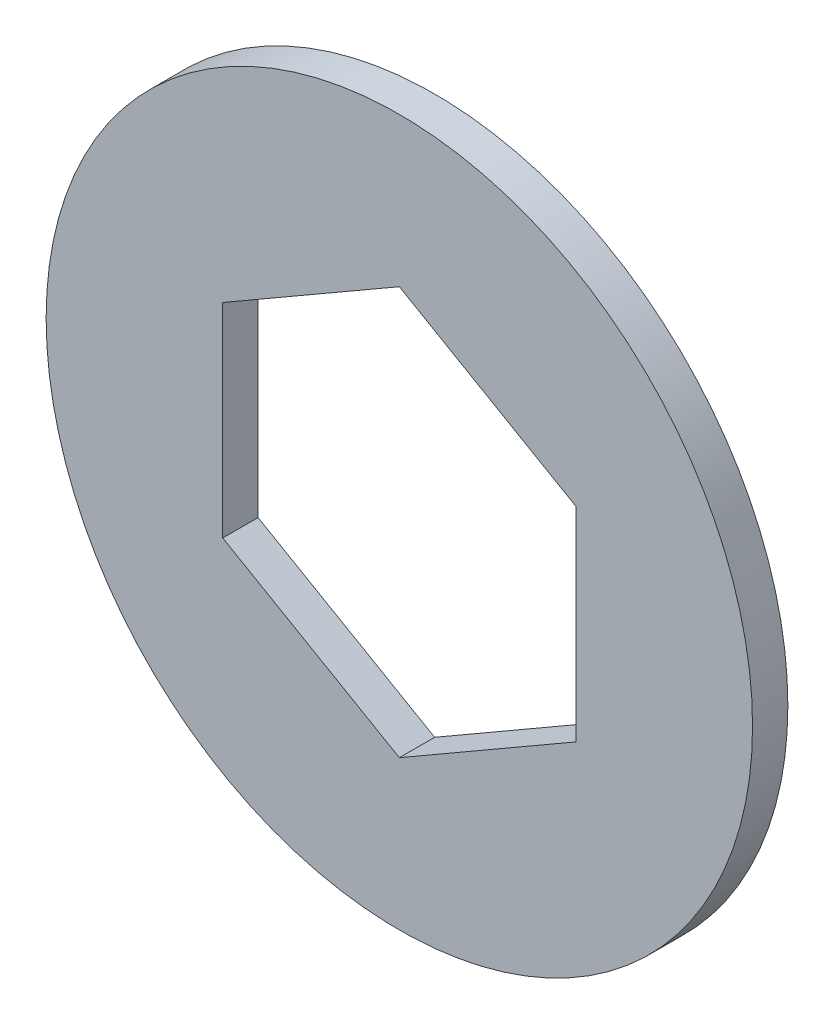
ISO-10303-21;
HEADER;
FILE_DESCRIPTION(('STEP AP214'),'2;1');
FILE_NAME('part.step','',(''),(''),'','','');
FILE_SCHEMA(('AUTOMOTIVE_DESIGN { 1 0 10303 214 1 1 1 1 }'));
ENDSEC;
DATA;
#1=APPLICATION_CONTEXT('core data for automotive mechanical design processes');
#2=APPLICATION_PROTOCOL_DEFINITION('international standard','automotive_design',2000,#1);
#3=PRODUCT_CONTEXT('',#1,'mechanical');
#4=PRODUCT('Part','Part','',(#3));
#5=PRODUCT_RELATED_PRODUCT_CATEGORY('part','',(#4));
#6=PRODUCT_DEFINITION_FORMATION('','',#4);
#7=PRODUCT_DEFINITION_CONTEXT('part definition',#1,'design');
#8=PRODUCT_DEFINITION('design','',#6,#7);
#9=PRODUCT_DEFINITION_SHAPE('','',#8);
#10=(LENGTH_UNIT() NAMED_UNIT(*) SI_UNIT(.MILLI.,.METRE.));
#11=(NAMED_UNIT(*) PLANE_ANGLE_UNIT() SI_UNIT($,.RADIAN.));
#12=(NAMED_UNIT(*) SI_UNIT($,.STERADIAN.) SOLID_ANGLE_UNIT());
#13=UNCERTAINTY_MEASURE_WITH_UNIT(LENGTH_MEASURE(1.E-05),#10,'distance_accuracy_value','');
#14=(GEOMETRIC_REPRESENTATION_CONTEXT(3) GLOBAL_UNCERTAINTY_ASSIGNED_CONTEXT((#13)) GLOBAL_UNIT_ASSIGNED_CONTEXT((#10,
#11,#12)) REPRESENTATION_CONTEXT('',''));
#15=CARTESIAN_POINT('',(0.,0.,0.));
#16=DIRECTION('',(0.,0.,1.));
#17=DIRECTION('',(1.,0.,0.));
#18=AXIS2_PLACEMENT_3D('',#15,#16,#17);
#19=CARTESIAN_POINT('',(0.,0.,5.));
#20=DIRECTION('',(0.,0.,1.));
#21=DIRECTION('',(1.,0.,0.));
#22=AXIS2_PLACEMENT_3D('',#19,#20,#21);
#23=PLANE('',#22);
#24=CARTESIAN_POINT('',(0.,0.,5.));
#25=DIRECTION('',(0.,0.,1.));
#26=DIRECTION('',(1.,0.,0.));
#27=AXIS2_PLACEMENT_3D('',#24,#25,#26);
#28=CIRCLE('',#27,50.);
#29=CARTESIAN_POINT('',(50.,0.,5.));
#30=VERTEX_POINT('',#29);
#31=EDGE_CURVE('E11',#30,#30,#28,.T.);
#32=ORIENTED_EDGE('',*,*,#31,.T.);
#33=EDGE_LOOP('',(#32));
#34=FACE_BOUND('',#33,.T.);
#35=DIRECTION('',(-0.866025403784438,-0.500000000000001,0.));
#36=VECTOR('',#35,1.);
#37=CARTESIAN_POINT('',(0.,28.8675134594813,5.));
#38=LINE('',#37,#36);
#39=CARTESIAN_POINT('',(0.,28.8675134594813,5.));
#40=VERTEX_POINT('',#39);
#41=CARTESIAN_POINT('',(-25.,14.4337567297406,5.));
#42=VERTEX_POINT('',#41);
#43=EDGE_CURVE('E102',#40,#42,#38,.T.);
#44=ORIENTED_EDGE('',*,*,#43,.F.);
#45=DIRECTION('',(-0.866025403784441,0.499999999999995,0.));
#46=VECTOR('',#45,1.);
#47=CARTESIAN_POINT('',(24.9999999999998,14.4337567297409,5.));
#48=LINE('',#47,#46);
#49=CARTESIAN_POINT('',(24.9999999999998,14.4337567297409,5.));
#50=VERTEX_POINT('',#49);
#51=EDGE_CURVE('E94',#50,#40,#48,.T.);
#52=ORIENTED_EDGE('',*,*,#51,.F.);
#53=DIRECTION('',(0.,1.,0.));
#54=VECTOR('',#53,1.);
#55=CARTESIAN_POINT('',(25.0000000000001,-14.4337567297404,5.));
#56=LINE('',#55,#54);
#57=CARTESIAN_POINT('',(25.0000000000001,-14.4337567297404,5.));
#58=VERTEX_POINT('',#57);
#59=EDGE_CURVE('E122',#58,#50,#56,.T.);
#60=ORIENTED_EDGE('',*,*,#59,.F.);
#61=DIRECTION('',(0.866025403784435,0.500000000000007,0.));
#62=VECTOR('',#61,1.);
#63=CARTESIAN_POINT('',(2.01580769085164E-13,-28.8675134594813,5.));
#64=LINE('',#63,#62);
#65=CARTESIAN_POINT('',(2.01580769085164E-13,-28.8675134594813,5.));
#66=VERTEX_POINT('',#65);
#67=EDGE_CURVE('E120',#66,#58,#64,.T.);
#68=ORIENTED_EDGE('',*,*,#67,.F.);
#69=DIRECTION('',(0.866025403784442,-0.499999999999995,0.));
#70=VECTOR('',#69,1.);
#71=CARTESIAN_POINT('',(-24.9999999999999,-14.4337567297408,5.));
#72=LINE('',#71,#70);
#73=CARTESIAN_POINT('',(-24.9999999999999,-14.4337567297408,5.));
#74=VERTEX_POINT('',#73);
#75=EDGE_CURVE('E116',#74,#66,#72,.T.);
#76=ORIENTED_EDGE('',*,*,#75,.F.);
#77=DIRECTION('',(0.,-1.,0.));
#78=VECTOR('',#77,1.);
#79=CARTESIAN_POINT('',(-25.,14.4337567297406,5.));
#80=LINE('',#79,#78);
#81=EDGE_CURVE('E114',#42,#74,#80,.T.);
#82=ORIENTED_EDGE('',*,*,#81,.F.);
#83=EDGE_LOOP('',(#44,#52,#60,#68,#76,#82));
#84=FACE_BOUND('',#83,.T.);
#85=ADVANCED_FACE('F41',(#34,#84),#23,.T.);
#86=CARTESIAN_POINT('',(0.,0.,0.));
#87=DIRECTION('',(0.,0.,1.));
#88=DIRECTION('',(1.,0.,0.));
#89=AXIS2_PLACEMENT_3D('',#86,#87,#88);
#90=PLANE('',#89);
#91=CARTESIAN_POINT('',(0.,0.,0.));
#92=DIRECTION('',(0.,0.,1.));
#93=DIRECTION('',(1.,0.,0.));
#94=AXIS2_PLACEMENT_3D('',#91,#92,#93);
#95=CIRCLE('',#94,50.);
#96=CARTESIAN_POINT('',(50.,0.,0.));
#97=VERTEX_POINT('',#96);
#98=EDGE_CURVE('E45',#97,#97,#95,.T.);
#99=ORIENTED_EDGE('',*,*,#98,.F.);
#100=EDGE_LOOP('',(#99));
#101=FACE_BOUND('',#100,.T.);
#102=DIRECTION('',(-0.866025403784441,0.499999999999995,0.));
#103=VECTOR('',#102,1.);
#104=CARTESIAN_POINT('',(24.9999999999998,14.4337567297409,0.));
#105=LINE('',#104,#103);
#106=CARTESIAN_POINT('',(24.9999999999998,14.4337567297409,0.));
#107=VERTEX_POINT('',#106);
#108=CARTESIAN_POINT('',(0.,28.8675134594813,0.));
#109=VERTEX_POINT('',#108);
#110=EDGE_CURVE('E64',#107,#109,#105,.T.);
#111=ORIENTED_EDGE('',*,*,#110,.T.);
#112=DIRECTION('',(-0.866025403784438,-0.500000000000001,0.));
#113=VECTOR('',#112,1.);
#114=CARTESIAN_POINT('',(0.,28.8675134594813,0.));
#115=LINE('',#114,#113);
#116=CARTESIAN_POINT('',(-25.,14.4337567297406,0.));
#117=VERTEX_POINT('',#116);
#118=EDGE_CURVE('E109',#109,#117,#115,.T.);
#119=ORIENTED_EDGE('',*,*,#118,.T.);
#120=DIRECTION('',(0.,-1.,0.));
#121=VECTOR('',#120,1.);
#122=CARTESIAN_POINT('',(-25.,14.4337567297406,0.));
#123=LINE('',#122,#121);
#124=CARTESIAN_POINT('',(-24.9999999999999,-14.4337567297408,0.));
#125=VERTEX_POINT('',#124);
#126=EDGE_CURVE('E126',#117,#125,#123,.T.);
#127=ORIENTED_EDGE('',*,*,#126,.T.);
#128=DIRECTION('',(0.866025403784442,-0.499999999999995,0.));
#129=VECTOR('',#128,1.);
#130=CARTESIAN_POINT('',(-24.9999999999999,-14.4337567297408,0.));
#131=LINE('',#130,#129);
#132=CARTESIAN_POINT('',(2.01580769085164E-13,-28.8675134594813,0.));
#133=VERTEX_POINT('',#132);
#134=EDGE_CURVE('E129',#125,#133,#131,.T.);
#135=ORIENTED_EDGE('',*,*,#134,.T.);
#136=DIRECTION('',(0.866025403784435,0.500000000000007,0.));
#137=VECTOR('',#136,1.);
#138=CARTESIAN_POINT('',(2.01580769085164E-13,-28.8675134594813,0.));
#139=LINE('',#138,#137);
#140=CARTESIAN_POINT('',(25.0000000000001,-14.4337567297404,0.));
#141=VERTEX_POINT('',#140);
#142=EDGE_CURVE('E132',#133,#141,#139,.T.);
#143=ORIENTED_EDGE('',*,*,#142,.T.);
#144=DIRECTION('',(0.,1.,0.));
#145=VECTOR('',#144,1.);
#146=CARTESIAN_POINT('',(25.0000000000001,-14.4337567297404,0.));
#147=LINE('',#146,#145);
#148=EDGE_CURVE('E103',#141,#107,#147,.T.);
#149=ORIENTED_EDGE('',*,*,#148,.T.);
#150=EDGE_LOOP('',(#111,#119,#127,#135,#143,#149));
#151=FACE_BOUND('',#150,.T.);
#152=ADVANCED_FACE('F149',(#101,#151),#90,.F.);
#153=CARTESIAN_POINT('',(0.,0.,5.));
#154=DIRECTION('',(0.,0.,-1.));
#155=DIRECTION('',(-1.,0.,0.));
#156=AXIS2_PLACEMENT_3D('',#153,#154,#155);
#157=CYLINDRICAL_SURFACE('',#156,50.);
#158=ORIENTED_EDGE('',*,*,#31,.F.);
#159=EDGE_LOOP('',(#158));
#160=FACE_BOUND('',#159,.T.);
#161=ORIENTED_EDGE('',*,*,#98,.T.);
#162=EDGE_LOOP('',(#161));
#163=FACE_BOUND('',#162,.T.);
#164=ADVANCED_FACE('F43',(#160,#163),#157,.T.);
#165=CARTESIAN_POINT('',(24.9999999999998,14.4337567297409,5.));
#166=DIRECTION('',(-0.499999999999995,-0.866025403784441,0.));
#167=DIRECTION('',(0.866025403784441,-0.499999999999995,0.));
#168=AXIS2_PLACEMENT_3D('',#165,#166,#167);
#169=PLANE('',#168);
#170=ORIENTED_EDGE('',*,*,#110,.F.);
#171=DIRECTION('',(0.,0.,-1.));
#172=VECTOR('',#171,1.);
#173=CARTESIAN_POINT('',(24.9999999999998,14.4337567297409,5.));
#174=LINE('',#173,#172);
#175=EDGE_CURVE('E98',#50,#107,#174,.T.);
#176=ORIENTED_EDGE('',*,*,#175,.F.);
#177=ORIENTED_EDGE('',*,*,#51,.T.);
#178=DIRECTION('',(0.,0.,-1.));
#179=VECTOR('',#178,1.);
#180=CARTESIAN_POINT('',(0.,28.8675134594813,5.));
#181=LINE('',#180,#179);
#182=EDGE_CURVE('E97',#40,#109,#181,.T.);
#183=ORIENTED_EDGE('',*,*,#182,.T.);
#184=EDGE_LOOP('',(#170,#176,#177,#183));
#185=FACE_BOUND('',#184,.T.);
#186=ADVANCED_FACE('F96',(#185),#169,.T.);
#187=CARTESIAN_POINT('',(0.,28.8675134594813,5.));
#188=DIRECTION('',(0.500000000000001,-0.866025403784438,0.));
#189=DIRECTION('',(0.866025403784438,0.500000000000001,0.));
#190=AXIS2_PLACEMENT_3D('',#187,#188,#189);
#191=PLANE('',#190);
#192=ORIENTED_EDGE('',*,*,#118,.F.);
#193=ORIENTED_EDGE('',*,*,#182,.F.);
#194=ORIENTED_EDGE('',*,*,#43,.T.);
#195=DIRECTION('',(0.,0.,-1.));
#196=VECTOR('',#195,1.);
#197=CARTESIAN_POINT('',(-25.,14.4337567297406,5.));
#198=LINE('',#197,#196);
#199=EDGE_CURVE('E110',#42,#117,#198,.T.);
#200=ORIENTED_EDGE('',*,*,#199,.T.);
#201=EDGE_LOOP('',(#192,#193,#194,#200));
#202=FACE_BOUND('',#201,.T.);
#203=ADVANCED_FACE('F106',(#202),#191,.T.);
#204=CARTESIAN_POINT('',(-25.,14.4337567297406,5.));
#205=DIRECTION('',(1.,0.,0.));
#206=DIRECTION('',(0.,1.,0.));
#207=AXIS2_PLACEMENT_3D('',#204,#205,#206);
#208=PLANE('',#207);
#209=ORIENTED_EDGE('',*,*,#126,.F.);
#210=ORIENTED_EDGE('',*,*,#199,.F.);
#211=ORIENTED_EDGE('',*,*,#81,.T.);
#212=DIRECTION('',(0.,0.,-1.));
#213=VECTOR('',#212,1.);
#214=CARTESIAN_POINT('',(-24.9999999999999,-14.4337567297408,5.));
#215=LINE('',#214,#213);
#216=EDGE_CURVE('E141',#74,#125,#215,.T.);
#217=ORIENTED_EDGE('',*,*,#216,.T.);
#218=EDGE_LOOP('',(#209,#210,#211,#217));
#219=FACE_BOUND('',#218,.T.);
#220=ADVANCED_FACE('F145',(#219),#208,.T.);
#221=CARTESIAN_POINT('',(-24.9999999999999,-14.4337567297408,5.));
#222=DIRECTION('',(0.499999999999995,0.866025403784442,0.));
#223=DIRECTION('',(-0.866025403784442,0.499999999999995,0.));
#224=AXIS2_PLACEMENT_3D('',#221,#222,#223);
#225=PLANE('',#224);
#226=ORIENTED_EDGE('',*,*,#134,.F.);
#227=ORIENTED_EDGE('',*,*,#216,.F.);
#228=ORIENTED_EDGE('',*,*,#75,.T.);
#229=DIRECTION('',(0.,0.,-1.));
#230=VECTOR('',#229,1.);
#231=CARTESIAN_POINT('',(2.01580769085164E-13,-28.8675134594813,5.));
#232=LINE('',#231,#230);
#233=EDGE_CURVE('E139',#66,#133,#232,.T.);
#234=ORIENTED_EDGE('',*,*,#233,.T.);
#235=EDGE_LOOP('',(#226,#227,#228,#234));
#236=FACE_BOUND('',#235,.T.);
#237=ADVANCED_FACE('F157',(#236),#225,.T.);
#238=CARTESIAN_POINT('',(2.01580769085164E-13,-28.8675134594813,5.));
#239=DIRECTION('',(-0.500000000000007,0.866025403784434,0.));
#240=DIRECTION('',(-0.866025403784435,-0.500000000000007,0.));
#241=AXIS2_PLACEMENT_3D('',#238,#239,#240);
#242=PLANE('',#241);
#243=ORIENTED_EDGE('',*,*,#142,.F.);
#244=ORIENTED_EDGE('',*,*,#233,.F.);
#245=ORIENTED_EDGE('',*,*,#67,.T.);
#246=DIRECTION('',(0.,0.,-1.));
#247=VECTOR('',#246,1.);
#248=CARTESIAN_POINT('',(25.0000000000001,-14.4337567297404,5.));
#249=LINE('',#248,#247);
#250=EDGE_CURVE('E56',#58,#141,#249,.T.);
#251=ORIENTED_EDGE('',*,*,#250,.T.);
#252=EDGE_LOOP('',(#243,#244,#245,#251));
#253=FACE_BOUND('',#252,.T.);
#254=ADVANCED_FACE('F155',(#253),#242,.T.);
#255=CARTESIAN_POINT('',(25.0000000000001,-14.4337567297404,5.));
#256=DIRECTION('',(-1.,0.,0.));
#257=DIRECTION('',(0.,-1.,0.));
#258=AXIS2_PLACEMENT_3D('',#255,#256,#257);
#259=PLANE('',#258);
#260=ORIENTED_EDGE('',*,*,#148,.F.);
#261=ORIENTED_EDGE('',*,*,#250,.F.);
#262=ORIENTED_EDGE('',*,*,#59,.T.);
#263=ORIENTED_EDGE('',*,*,#175,.T.);
#264=EDGE_LOOP('',(#260,#261,#262,#263));
#265=FACE_BOUND('',#264,.T.);
#266=ADVANCED_FACE('F151',(#265),#259,.T.);
#267=CLOSED_SHELL('',(#85,#152,#164,#186,#203,#220,#237,#254,#266));
#268=MANIFOLD_SOLID_BREP('B2',#267);
#269=ADVANCED_BREP_SHAPE_REPRESENTATION('',(#18,#268),#14);
#270=SHAPE_DEFINITION_REPRESENTATION(#9,#269);
ENDSEC;
END-ISO-10303-21;
